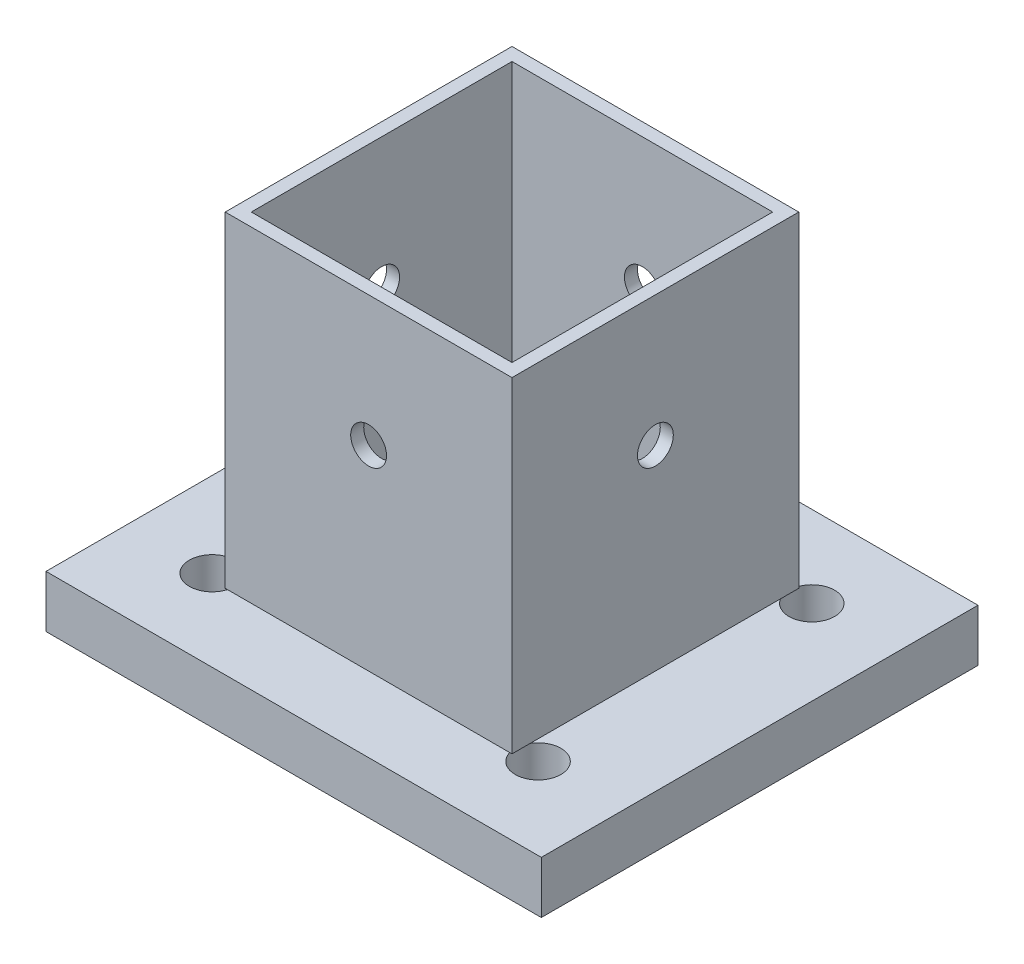
ISO-10303-21;
HEADER;
FILE_DESCRIPTION(('STEP AP214'),'2;1');
FILE_NAME('part.step','',(''),(''),'','','');
FILE_SCHEMA(('AUTOMOTIVE_DESIGN { 1 0 10303 214 1 1 1 1 }'));
ENDSEC;
DATA;
#1=APPLICATION_CONTEXT('core data for automotive mechanical design processes');
#2=APPLICATION_PROTOCOL_DEFINITION('international standard','automotive_design',2000,#1);
#3=PRODUCT_CONTEXT('',#1,'mechanical');
#4=PRODUCT('Part','Part','',(#3));
#5=PRODUCT_RELATED_PRODUCT_CATEGORY('part','',(#4));
#6=PRODUCT_DEFINITION_FORMATION('','',#4);
#7=PRODUCT_DEFINITION_CONTEXT('part definition',#1,'design');
#8=PRODUCT_DEFINITION('design','',#6,#7);
#9=PRODUCT_DEFINITION_SHAPE('','',#8);
#10=(LENGTH_UNIT() NAMED_UNIT(*) SI_UNIT(.MILLI.,.METRE.));
#11=(NAMED_UNIT(*) PLANE_ANGLE_UNIT() SI_UNIT($,.RADIAN.));
#12=(NAMED_UNIT(*) SI_UNIT($,.STERADIAN.) SOLID_ANGLE_UNIT());
#13=UNCERTAINTY_MEASURE_WITH_UNIT(LENGTH_MEASURE(1.E-05),#10,'distance_accuracy_value','');
#14=(GEOMETRIC_REPRESENTATION_CONTEXT(3) GLOBAL_UNCERTAINTY_ASSIGNED_CONTEXT((#13)) GLOBAL_UNIT_ASSIGNED_CONTEXT((#10,
#11,#12)) REPRESENTATION_CONTEXT('',''));
#15=CARTESIAN_POINT('',(0.,0.,0.));
#16=DIRECTION('',(0.,0.,1.));
#17=DIRECTION('',(1.,0.,0.));
#18=AXIS2_PLACEMENT_3D('',#15,#16,#17);
#19=CARTESIAN_POINT('',(0.,7.99999999999998,0.));
#20=DIRECTION('',(0.,-1.,0.));
#21=DIRECTION('',(0.,0.,-1.));
#22=AXIS2_PLACEMENT_3D('',#19,#20,#21);
#23=PLANE('',#22);
#24=DIRECTION('',(0.,0.,1.));
#25=VECTOR('',#24,1.);
#26=CARTESIAN_POINT('',(-38.,7.99999999999998,-33.4999999999999));
#27=LINE('',#26,#25);
#28=CARTESIAN_POINT('',(-38.,7.99999999999998,-33.4999999999999));
#29=VERTEX_POINT('',#28);
#30=CARTESIAN_POINT('',(-38.,7.99999999999998,33.5000000000001));
#31=VERTEX_POINT('',#30);
#32=EDGE_CURVE('E292',#29,#31,#27,.T.);
#33=ORIENTED_EDGE('',*,*,#32,.T.);
#34=DIRECTION('',(1.,0.,0.));
#35=VECTOR('',#34,1.);
#36=CARTESIAN_POINT('',(38.,8.00000000000001,33.4999999999999));
#37=LINE('',#36,#35);
#38=CARTESIAN_POINT('',(38.,8.00000000000001,33.4999999999999));
#39=VERTEX_POINT('',#38);
#40=EDGE_CURVE('E295',#31,#39,#37,.T.);
#41=ORIENTED_EDGE('',*,*,#40,.T.);
#42=DIRECTION('',(0.,0.,-1.));
#43=VECTOR('',#42,1.);
#44=CARTESIAN_POINT('',(38.,8.00000000000001,-33.5000000000001));
#45=LINE('',#44,#43);
#46=CARTESIAN_POINT('',(38.,8.00000000000001,-33.5000000000001));
#47=VERTEX_POINT('',#46);
#48=EDGE_CURVE('E298',#39,#47,#45,.T.);
#49=ORIENTED_EDGE('',*,*,#48,.T.);
#50=DIRECTION('',(-1.,0.,0.));
#51=VECTOR('',#50,1.);
#52=CARTESIAN_POINT('',(38.,8.00000000000001,-33.5000000000001));
#53=LINE('',#52,#51);
#54=EDGE_CURVE('E300',#47,#29,#53,.T.);
#55=ORIENTED_EDGE('',*,*,#54,.T.);
#56=EDGE_LOOP('',(#33,#41,#49,#55));
#57=FACE_BOUND('',#56,.T.);
#58=DIRECTION('',(0.,0.,1.));
#59=VECTOR('',#58,1.);
#60=CARTESIAN_POINT('',(-22.,8.00000000000001,0.));
#61=LINE('',#60,#59);
#62=CARTESIAN_POINT('',(-22.,8.00000000000001,-19.197224362268));
#63=VERTEX_POINT('',#62);
#64=CARTESIAN_POINT('',(-22.,8.00000000000001,19.197224362268));
#65=VERTEX_POINT('',#64);
#66=EDGE_CURVE('E14',#63,#65,#61,.T.);
#67=ORIENTED_EDGE('',*,*,#66,.F.);
#68=CARTESIAN_POINT('',(-25.,8.00000000000001,-20.9999999999999));
#69=DIRECTION('',(0.,1.,0.));
#70=DIRECTION('',(0.,0.,1.));
#71=AXIS2_PLACEMENT_3D('',#68,#69,#70);
#72=CIRCLE('',#71,3.5);
#73=CARTESIAN_POINT('',(-21.6458980337503,8.00000000000001,-22.));
#74=VERTEX_POINT('',#73);
#75=EDGE_CURVE('E289',#74,#63,#72,.T.);
#76=ORIENTED_EDGE('',*,*,#75,.F.);
#77=DIRECTION('',(-1.,0.,0.));
#78=VECTOR('',#77,1.);
#79=CARTESIAN_POINT('',(0.,7.99999999999998,-22.));
#80=LINE('',#79,#78);
#81=CARTESIAN_POINT('',(21.6458980337503,7.99999999999998,-22.));
#82=VERTEX_POINT('',#81);
#83=EDGE_CURVE('E80',#82,#74,#80,.T.);
#84=ORIENTED_EDGE('',*,*,#83,.F.);
#85=CARTESIAN_POINT('',(25.,7.99999999999998,-21.0000000000001));
#86=DIRECTION('',(0.,1.,0.));
#87=DIRECTION('',(0.,0.,-1.));
#88=AXIS2_PLACEMENT_3D('',#85,#86,#87);
#89=CIRCLE('',#88,3.5);
#90=CARTESIAN_POINT('',(22.,7.99999999999998,-19.197224362268));
#91=VERTEX_POINT('',#90);
#92=EDGE_CURVE('E282',#91,#82,#89,.T.);
#93=ORIENTED_EDGE('',*,*,#92,.F.);
#94=DIRECTION('',(0.,0.,-1.));
#95=VECTOR('',#94,1.);
#96=CARTESIAN_POINT('',(22.,7.99999999999998,0.));
#97=LINE('',#96,#95);
#98=CARTESIAN_POINT('',(22.,7.99999999999998,19.197224362268));
#99=VERTEX_POINT('',#98);
#100=EDGE_CURVE('E252',#99,#91,#97,.T.);
#101=ORIENTED_EDGE('',*,*,#100,.F.);
#102=CARTESIAN_POINT('',(25.,7.99999999999998,20.9999999999999));
#103=DIRECTION('',(0.,1.,0.));
#104=DIRECTION('',(0.,0.,1.));
#105=AXIS2_PLACEMENT_3D('',#102,#103,#104);
#106=CIRCLE('',#105,3.5);
#107=CARTESIAN_POINT('',(21.6458980337503,7.99999999999998,22.));
#108=VERTEX_POINT('',#107);
#109=EDGE_CURVE('E275',#108,#99,#106,.T.);
#110=ORIENTED_EDGE('',*,*,#109,.F.);
#111=DIRECTION('',(1.,0.,0.));
#112=VECTOR('',#111,1.);
#113=CARTESIAN_POINT('',(0.,7.99999999999998,22.));
#114=LINE('',#113,#112);
#115=CARTESIAN_POINT('',(-21.6458980337503,8.00000000000001,22.));
#116=VERTEX_POINT('',#115);
#117=EDGE_CURVE('E247',#116,#108,#114,.T.);
#118=ORIENTED_EDGE('',*,*,#117,.F.);
#119=CARTESIAN_POINT('',(-25.,8.00000000000001,21.0000000000001));
#120=DIRECTION('',(0.,1.,0.));
#121=DIRECTION('',(0.,0.,-1.));
#122=AXIS2_PLACEMENT_3D('',#119,#120,#121);
#123=CIRCLE('',#122,3.5);
#124=EDGE_CURVE('E98',#65,#116,#123,.T.);
#125=ORIENTED_EDGE('',*,*,#124,.F.);
#126=EDGE_LOOP('',(#67,#76,#84,#93,#101,#110,#118,#125));
#127=FACE_BOUND('',#126,.T.);
#128=ADVANCED_FACE('F71',(#57,#127),#23,.F.);
#129=CARTESIAN_POINT('',(0.,0.,0.));
#130=DIRECTION('',(0.,-1.,0.));
#131=DIRECTION('',(0.,0.,-1.));
#132=AXIS2_PLACEMENT_3D('',#129,#130,#131);
#133=PLANE('',#132);
#134=CARTESIAN_POINT('',(25.,0.,20.9999999999999));
#135=DIRECTION('',(0.,1.,0.));
#136=DIRECTION('',(0.,0.,1.));
#137=AXIS2_PLACEMENT_3D('',#134,#135,#136);
#138=CIRCLE('',#137,3.5);
#139=CARTESIAN_POINT('',(25.,0.,24.4999999999999));
#140=VERTEX_POINT('',#139);
#141=EDGE_CURVE('E269',#140,#140,#138,.T.);
#142=ORIENTED_EDGE('',*,*,#141,.T.);
#143=EDGE_LOOP('',(#142));
#144=FACE_BOUND('',#143,.T.);
#145=CARTESIAN_POINT('',(-25.,0.,-20.9999999999999));
#146=DIRECTION('',(0.,1.,0.));
#147=DIRECTION('',(0.,0.,1.));
#148=AXIS2_PLACEMENT_3D('',#145,#146,#147);
#149=CIRCLE('',#148,3.5);
#150=CARTESIAN_POINT('',(-25.,0.,-17.4999999999999));
#151=VERTEX_POINT('',#150);
#152=EDGE_CURVE('E281',#151,#151,#149,.T.);
#153=ORIENTED_EDGE('',*,*,#152,.T.);
#154=EDGE_LOOP('',(#153));
#155=FACE_BOUND('',#154,.T.);
#156=DIRECTION('',(0.,0.,1.));
#157=VECTOR('',#156,1.);
#158=CARTESIAN_POINT('',(-38.,0.,-33.4999999999999));
#159=LINE('',#158,#157);
#160=CARTESIAN_POINT('',(-38.,0.,-33.4999999999999));
#161=VERTEX_POINT('',#160);
#162=CARTESIAN_POINT('',(-38.,0.,33.5000000000001));
#163=VERTEX_POINT('',#162);
#164=EDGE_CURVE('E288',#161,#163,#159,.T.);
#165=ORIENTED_EDGE('',*,*,#164,.F.);
#166=DIRECTION('',(-1.,0.,0.));
#167=VECTOR('',#166,1.);
#168=CARTESIAN_POINT('',(37.9999999999998,0.,-33.5000000000001));
#169=LINE('',#168,#167);
#170=CARTESIAN_POINT('',(37.9999999999998,0.,-33.5000000000001));
#171=VERTEX_POINT('',#170);
#172=EDGE_CURVE('E296',#171,#161,#169,.T.);
#173=ORIENTED_EDGE('',*,*,#172,.F.);
#174=DIRECTION('',(0.,0.,-1.));
#175=VECTOR('',#174,1.);
#176=CARTESIAN_POINT('',(37.9999999999998,0.,-33.5000000000001));
#177=LINE('',#176,#175);
#178=CARTESIAN_POINT('',(38.,0.,33.4999999999999));
#179=VERTEX_POINT('',#178);
#180=EDGE_CURVE('E307',#179,#171,#177,.T.);
#181=ORIENTED_EDGE('',*,*,#180,.F.);
#182=DIRECTION('',(1.,0.,0.));
#183=VECTOR('',#182,1.);
#184=CARTESIAN_POINT('',(38.,0.,33.4999999999999));
#185=LINE('',#184,#183);
#186=EDGE_CURVE('E305',#163,#179,#185,.T.);
#187=ORIENTED_EDGE('',*,*,#186,.F.);
#188=EDGE_LOOP('',(#165,#173,#181,#187));
#189=FACE_BOUND('',#188,.T.);
#190=CARTESIAN_POINT('',(24.9999999999998,0.,-21.0000000000001));
#191=DIRECTION('',(0.,1.,0.));
#192=DIRECTION('',(0.,0.,-1.));
#193=AXIS2_PLACEMENT_3D('',#190,#191,#192);
#194=CIRCLE('',#193,3.5);
#195=CARTESIAN_POINT('',(24.9999999999998,0.,-24.5000000000001));
#196=VERTEX_POINT('',#195);
#197=EDGE_CURVE('E274',#196,#196,#194,.T.);
#198=ORIENTED_EDGE('',*,*,#197,.T.);
#199=EDGE_LOOP('',(#198));
#200=FACE_BOUND('',#199,.T.);
#201=CARTESIAN_POINT('',(-25.,0.,21.0000000000001));
#202=DIRECTION('',(0.,1.,0.));
#203=DIRECTION('',(0.,0.,-1.));
#204=AXIS2_PLACEMENT_3D('',#201,#202,#203);
#205=CIRCLE('',#204,3.5);
#206=CARTESIAN_POINT('',(-25.,0.,17.5000000000001));
#207=VERTEX_POINT('',#206);
#208=EDGE_CURVE('E266',#207,#207,#205,.T.);
#209=ORIENTED_EDGE('',*,*,#208,.T.);
#210=EDGE_LOOP('',(#209));
#211=FACE_BOUND('',#210,.T.);
#212=ADVANCED_FACE('F361',(#144,#155,#189,#200,#211),#133,.T.);
#213=CARTESIAN_POINT('',(-38.,7.99999999999998,-33.4999999999999));
#214=DIRECTION('',(1.,0.,0.));
#215=DIRECTION('',(0.,0.,-1.));
#216=AXIS2_PLACEMENT_3D('',#213,#214,#215);
#217=PLANE('',#216);
#218=ORIENTED_EDGE('',*,*,#164,.T.);
#219=DIRECTION('',(0.,-1.,0.));
#220=VECTOR('',#219,1.);
#221=CARTESIAN_POINT('',(-38.,7.99999999999998,33.5000000000001));
#222=LINE('',#221,#220);
#223=EDGE_CURVE('E75',#31,#163,#222,.T.);
#224=ORIENTED_EDGE('',*,*,#223,.F.);
#225=ORIENTED_EDGE('',*,*,#32,.F.);
#226=DIRECTION('',(0.,-1.,0.));
#227=VECTOR('',#226,1.);
#228=CARTESIAN_POINT('',(-38.,7.99999999999998,-33.4999999999999));
#229=LINE('',#228,#227);
#230=EDGE_CURVE('E302',#29,#161,#229,.T.);
#231=ORIENTED_EDGE('',*,*,#230,.T.);
#232=EDGE_LOOP('',(#218,#224,#225,#231));
#233=FACE_BOUND('',#232,.T.);
#234=ADVANCED_FACE('F73',(#233),#217,.F.);
#235=CARTESIAN_POINT('',(38.,8.00000000000001,33.4999999999999));
#236=DIRECTION('',(0.,0.,-1.));
#237=DIRECTION('',(-1.,0.,0.));
#238=AXIS2_PLACEMENT_3D('',#235,#236,#237);
#239=PLANE('',#238);
#240=ORIENTED_EDGE('',*,*,#186,.T.);
#241=DIRECTION('',(0.,-1.,0.));
#242=VECTOR('',#241,1.);
#243=CARTESIAN_POINT('',(38.,8.00000000000001,33.4999999999999));
#244=LINE('',#243,#242);
#245=EDGE_CURVE('E314',#39,#179,#244,.T.);
#246=ORIENTED_EDGE('',*,*,#245,.F.);
#247=ORIENTED_EDGE('',*,*,#40,.F.);
#248=ORIENTED_EDGE('',*,*,#223,.T.);
#249=EDGE_LOOP('',(#240,#246,#247,#248));
#250=FACE_BOUND('',#249,.T.);
#251=ADVANCED_FACE('F465',(#250),#239,.F.);
#252=CARTESIAN_POINT('',(38.,8.00000000000001,-33.5000000000001));
#253=DIRECTION('',(-1.,0.,0.));
#254=DIRECTION('',(0.,0.,1.));
#255=AXIS2_PLACEMENT_3D('',#252,#253,#254);
#256=PLANE('',#255);
#257=ORIENTED_EDGE('',*,*,#180,.T.);
#258=DIRECTION('',(0.,-1.,0.));
#259=VECTOR('',#258,1.);
#260=CARTESIAN_POINT('',(38.,8.00000000000001,-33.5000000000001));
#261=LINE('',#260,#259);
#262=EDGE_CURVE('E312',#47,#171,#261,.T.);
#263=ORIENTED_EDGE('',*,*,#262,.F.);
#264=ORIENTED_EDGE('',*,*,#48,.F.);
#265=ORIENTED_EDGE('',*,*,#245,.T.);
#266=EDGE_LOOP('',(#257,#263,#264,#265));
#267=FACE_BOUND('',#266,.T.);
#268=ADVANCED_FACE('F464',(#267),#256,.F.);
#269=CARTESIAN_POINT('',(38.,8.00000000000001,-33.5000000000001));
#270=DIRECTION('',(0.,0.,1.));
#271=DIRECTION('',(1.,0.,0.));
#272=AXIS2_PLACEMENT_3D('',#269,#270,#271);
#273=PLANE('',#272);
#274=ORIENTED_EDGE('',*,*,#172,.T.);
#275=ORIENTED_EDGE('',*,*,#230,.F.);
#276=ORIENTED_EDGE('',*,*,#54,.F.);
#277=ORIENTED_EDGE('',*,*,#262,.T.);
#278=EDGE_LOOP('',(#274,#275,#276,#277));
#279=FACE_BOUND('',#278,.T.);
#280=ADVANCED_FACE('F452',(#279),#273,.F.);
#281=CARTESIAN_POINT('',(-25.,8.00000000000001,-20.9999999999999));
#282=DIRECTION('',(0.,-1.,0.));
#283=DIRECTION('',(0.,0.,-1.));
#284=AXIS2_PLACEMENT_3D('',#281,#282,#283);
#285=CYLINDRICAL_SURFACE('',#284,3.5);
#286=EDGE_CURVE('E285',#63,#74,#72,.T.);
#287=ORIENTED_EDGE('',*,*,#286,.T.);
#288=ORIENTED_EDGE('',*,*,#75,.T.);
#289=EDGE_LOOP('',(#287,#288));
#290=FACE_BOUND('',#289,.T.);
#291=ORIENTED_EDGE('',*,*,#152,.F.);
#292=EDGE_LOOP('',(#291));
#293=FACE_BOUND('',#292,.T.);
#294=ADVANCED_FACE('F357',(#290,#293),#285,.F.);
#295=CARTESIAN_POINT('',(25.,7.99999999999998,-21.0000000000001));
#296=DIRECTION('',(0.,-1.,0.));
#297=DIRECTION('',(0.,0.,-1.));
#298=AXIS2_PLACEMENT_3D('',#295,#296,#297);
#299=CYLINDRICAL_SURFACE('',#298,3.5);
#300=EDGE_CURVE('E278',#82,#91,#89,.T.);
#301=ORIENTED_EDGE('',*,*,#300,.T.);
#302=ORIENTED_EDGE('',*,*,#92,.T.);
#303=EDGE_LOOP('',(#301,#302));
#304=FACE_BOUND('',#303,.T.);
#305=ORIENTED_EDGE('',*,*,#197,.F.);
#306=EDGE_LOOP('',(#305));
#307=FACE_BOUND('',#306,.T.);
#308=ADVANCED_FACE('F354',(#304,#307),#299,.F.);
#309=CARTESIAN_POINT('',(25.,7.99999999999998,20.9999999999999));
#310=DIRECTION('',(0.,-1.,0.));
#311=DIRECTION('',(0.,0.,-1.));
#312=AXIS2_PLACEMENT_3D('',#309,#310,#311);
#313=CYLINDRICAL_SURFACE('',#312,3.5);
#314=EDGE_CURVE('E272',#99,#108,#106,.T.);
#315=ORIENTED_EDGE('',*,*,#314,.T.);
#316=ORIENTED_EDGE('',*,*,#109,.T.);
#317=EDGE_LOOP('',(#315,#316));
#318=FACE_BOUND('',#317,.T.);
#319=ORIENTED_EDGE('',*,*,#141,.F.);
#320=EDGE_LOOP('',(#319));
#321=FACE_BOUND('',#320,.T.);
#322=ADVANCED_FACE('F340',(#318,#321),#313,.F.);
#323=CARTESIAN_POINT('',(-25.,8.00000000000001,21.0000000000001));
#324=DIRECTION('',(0.,-1.,0.));
#325=DIRECTION('',(0.,0.,-1.));
#326=AXIS2_PLACEMENT_3D('',#323,#324,#325);
#327=CYLINDRICAL_SURFACE('',#326,3.5);
#328=EDGE_CURVE('E267',#116,#65,#123,.T.);
#329=ORIENTED_EDGE('',*,*,#328,.T.);
#330=ORIENTED_EDGE('',*,*,#124,.T.);
#331=EDGE_LOOP('',(#329,#330));
#332=FACE_BOUND('',#331,.T.);
#333=ORIENTED_EDGE('',*,*,#208,.F.);
#334=EDGE_LOOP('',(#333));
#335=FACE_BOUND('',#334,.T.);
#336=ADVANCED_FACE('F368',(#332,#335),#327,.F.);
#337=CARTESIAN_POINT('',(0.,7.99999999999998,0.));
#338=DIRECTION('',(0.,1.,0.));
#339=DIRECTION('',(0.,0.,1.));
#340=AXIS2_PLACEMENT_3D('',#337,#338,#339);
#341=PLANE('',#340);
#342=ORIENTED_EDGE('',*,*,#286,.F.);
#343=CARTESIAN_POINT('',(-22.,8.00000000000001,-22.));
#344=VERTEX_POINT('',#343);
#345=EDGE_CURVE('E82',#344,#63,#61,.T.);
#346=ORIENTED_EDGE('',*,*,#345,.F.);
#347=EDGE_CURVE('E251',#74,#344,#80,.T.);
#348=ORIENTED_EDGE('',*,*,#347,.F.);
#349=EDGE_LOOP('',(#342,#346,#348));
#350=FACE_BOUND('',#349,.T.);
#351=ADVANCED_FACE('F370',(#350),#341,.F.);
#352=ORIENTED_EDGE('',*,*,#300,.F.);
#353=CARTESIAN_POINT('',(22.,7.99999999999998,-22.));
#354=VERTEX_POINT('',#353);
#355=EDGE_CURVE('E234',#354,#82,#80,.T.);
#356=ORIENTED_EDGE('',*,*,#355,.F.);
#357=EDGE_CURVE('E246',#91,#354,#97,.T.);
#358=ORIENTED_EDGE('',*,*,#357,.F.);
#359=EDGE_LOOP('',(#352,#356,#358));
#360=FACE_BOUND('',#359,.T.);
#361=ADVANCED_FACE('F352',(#360),#341,.F.);
#362=ORIENTED_EDGE('',*,*,#314,.F.);
#363=CARTESIAN_POINT('',(22.,7.99999999999998,22.));
#364=VERTEX_POINT('',#363);
#365=EDGE_CURVE('E248',#364,#99,#97,.T.);
#366=ORIENTED_EDGE('',*,*,#365,.F.);
#367=EDGE_CURVE('E242',#108,#364,#114,.T.);
#368=ORIENTED_EDGE('',*,*,#367,.F.);
#369=EDGE_LOOP('',(#362,#366,#368));
#370=FACE_BOUND('',#369,.T.);
#371=ADVANCED_FACE('F336',(#370),#341,.F.);
#372=CARTESIAN_POINT('',(0.,58.,0.));
#373=DIRECTION('',(0.,1.,0.));
#374=DIRECTION('',(0.,0.,1.));
#375=AXIS2_PLACEMENT_3D('',#372,#373,#374);
#376=PLANE('',#375);
#377=DIRECTION('',(0.,0.,1.));
#378=VECTOR('',#377,1.);
#379=CARTESIAN_POINT('',(-22.,58.,0.));
#380=LINE('',#379,#378);
#381=CARTESIAN_POINT('',(-22.,58.,-22.));
#382=VERTEX_POINT('',#381);
#383=CARTESIAN_POINT('',(-22.,58.,22.));
#384=VERTEX_POINT('',#383);
#385=EDGE_CURVE('E230',#382,#384,#380,.T.);
#386=ORIENTED_EDGE('',*,*,#385,.T.);
#387=DIRECTION('',(1.,0.,0.));
#388=VECTOR('',#387,1.);
#389=CARTESIAN_POINT('',(0.,58.,22.));
#390=LINE('',#389,#388);
#391=CARTESIAN_POINT('',(22.,58.,22.));
#392=VERTEX_POINT('',#391);
#393=EDGE_CURVE('E233',#384,#392,#390,.T.);
#394=ORIENTED_EDGE('',*,*,#393,.T.);
#395=DIRECTION('',(0.,0.,-1.));
#396=VECTOR('',#395,1.);
#397=CARTESIAN_POINT('',(21.9999999999998,58.,0.));
#398=LINE('',#397,#396);
#399=CARTESIAN_POINT('',(22.,58.,-22.));
#400=VERTEX_POINT('',#399);
#401=EDGE_CURVE('E236',#392,#400,#398,.T.);
#402=ORIENTED_EDGE('',*,*,#401,.T.);
#403=DIRECTION('',(-1.,0.,0.));
#404=VECTOR('',#403,1.);
#405=CARTESIAN_POINT('',(0.,58.,-22.));
#406=LINE('',#405,#404);
#407=EDGE_CURVE('E238',#400,#382,#406,.T.);
#408=ORIENTED_EDGE('',*,*,#407,.T.);
#409=EDGE_LOOP('',(#386,#394,#402,#408));
#410=FACE_BOUND('',#409,.T.);
#411=DIRECTION('',(1.,0.,0.));
#412=VECTOR('',#411,1.);
#413=CARTESIAN_POINT('',(20.,58.,20.));
#414=LINE('',#413,#412);
#415=CARTESIAN_POINT('',(-20.,57.9999999999999,20.));
#416=VERTEX_POINT('',#415);
#417=CARTESIAN_POINT('',(20.,58.,20.));
#418=VERTEX_POINT('',#417);
#419=EDGE_CURVE('E197',#416,#418,#414,.T.);
#420=ORIENTED_EDGE('',*,*,#419,.F.);
#421=DIRECTION('',(0.,0.,1.));
#422=VECTOR('',#421,1.);
#423=CARTESIAN_POINT('',(-20.,57.9999999999999,-20.));
#424=LINE('',#423,#422);
#425=CARTESIAN_POINT('',(-20.,57.9999999999999,-20.));
#426=VERTEX_POINT('',#425);
#427=EDGE_CURVE('E189',#426,#416,#424,.T.);
#428=ORIENTED_EDGE('',*,*,#427,.F.);
#429=DIRECTION('',(-1.,0.,0.));
#430=VECTOR('',#429,1.);
#431=CARTESIAN_POINT('',(20.,58.,-20.));
#432=LINE('',#431,#430);
#433=CARTESIAN_POINT('',(20.,58.,-20.));
#434=VERTEX_POINT('',#433);
#435=EDGE_CURVE('E212',#434,#426,#432,.T.);
#436=ORIENTED_EDGE('',*,*,#435,.F.);
#437=DIRECTION('',(0.,0.,-1.));
#438=VECTOR('',#437,1.);
#439=CARTESIAN_POINT('',(20.,58.,-20.));
#440=LINE('',#439,#438);
#441=EDGE_CURVE('E210',#418,#434,#440,.T.);
#442=ORIENTED_EDGE('',*,*,#441,.F.);
#443=EDGE_LOOP('',(#420,#428,#436,#442));
#444=FACE_BOUND('',#443,.T.);
#445=ADVANCED_FACE('F208',(#410,#444),#376,.T.);
#446=ORIENTED_EDGE('',*,*,#328,.F.);
#447=CARTESIAN_POINT('',(-22.,8.00000000000001,22.));
#448=VERTEX_POINT('',#447);
#449=EDGE_CURVE('E243',#448,#116,#114,.T.);
#450=ORIENTED_EDGE('',*,*,#449,.F.);
#451=EDGE_CURVE('E83',#65,#448,#61,.T.);
#452=ORIENTED_EDGE('',*,*,#451,.F.);
#453=EDGE_LOOP('',(#446,#450,#452));
#454=FACE_BOUND('',#453,.T.);
#455=ADVANCED_FACE('F379',(#454),#341,.F.);
#456=CARTESIAN_POINT('',(-22.,58.,0.));
#457=DIRECTION('',(1.,0.,0.));
#458=DIRECTION('',(0.,0.,-1.));
#459=AXIS2_PLACEMENT_3D('',#456,#457,#458);
#460=PLANE('',#459);
#461=CARTESIAN_POINT('',(-22.,38.,0.));
#462=DIRECTION('',(-1.,0.,0.));
#463=DIRECTION('',(0.,0.,1.));
#464=AXIS2_PLACEMENT_3D('',#461,#462,#463);
#465=CIRCLE('',#464,2.75);
#466=CARTESIAN_POINT('',(-22.,38.,2.75));
#467=VERTEX_POINT('',#466);
#468=EDGE_CURVE('E439',#467,#467,#465,.T.);
#469=ORIENTED_EDGE('',*,*,#468,.F.);
#470=EDGE_LOOP('',(#469));
#471=FACE_BOUND('',#470,.T.);
#472=ORIENTED_EDGE('',*,*,#345,.T.);
#473=ORIENTED_EDGE('',*,*,#66,.T.);
#474=ORIENTED_EDGE('',*,*,#451,.T.);
#475=DIRECTION('',(0.,-1.,0.));
#476=VECTOR('',#475,1.);
#477=CARTESIAN_POINT('',(-22.,58.,22.));
#478=LINE('',#477,#476);
#479=EDGE_CURVE('E263',#384,#448,#478,.T.);
#480=ORIENTED_EDGE('',*,*,#479,.F.);
#481=ORIENTED_EDGE('',*,*,#385,.F.);
#482=DIRECTION('',(0.,-1.,0.));
#483=VECTOR('',#482,1.);
#484=CARTESIAN_POINT('',(-22.,58.,-22.));
#485=LINE('',#484,#483);
#486=EDGE_CURVE('E239',#382,#344,#485,.T.);
#487=ORIENTED_EDGE('',*,*,#486,.T.);
#488=EDGE_LOOP('',(#472,#473,#474,#480,#481,#487));
#489=FACE_BOUND('',#488,.T.);
#490=ADVANCED_FACE('F422',(#471,#489),#460,.F.);
#491=CARTESIAN_POINT('',(0.,58.,22.));
#492=DIRECTION('',(0.,0.,-1.));
#493=DIRECTION('',(-1.,0.,0.));
#494=AXIS2_PLACEMENT_3D('',#491,#492,#493);
#495=PLANE('',#494);
#496=CARTESIAN_POINT('',(0.,38.,22.));
#497=DIRECTION('',(0.,0.,1.));
#498=DIRECTION('',(1.,0.,0.));
#499=AXIS2_PLACEMENT_3D('',#496,#497,#498);
#500=CIRCLE('',#499,2.75);
#501=CARTESIAN_POINT('',(2.75,38.,22.));
#502=VERTEX_POINT('',#501);
#503=EDGE_CURVE('E219',#502,#502,#500,.T.);
#504=ORIENTED_EDGE('',*,*,#503,.F.);
#505=EDGE_LOOP('',(#504));
#506=FACE_BOUND('',#505,.T.);
#507=ORIENTED_EDGE('',*,*,#449,.T.);
#508=ORIENTED_EDGE('',*,*,#117,.T.);
#509=ORIENTED_EDGE('',*,*,#367,.T.);
#510=DIRECTION('',(0.,-1.,0.));
#511=VECTOR('',#510,1.);
#512=CARTESIAN_POINT('',(22.,58.,22.));
#513=LINE('',#512,#511);
#514=EDGE_CURVE('E260',#392,#364,#513,.T.);
#515=ORIENTED_EDGE('',*,*,#514,.F.);
#516=ORIENTED_EDGE('',*,*,#393,.F.);
#517=ORIENTED_EDGE('',*,*,#479,.T.);
#518=EDGE_LOOP('',(#507,#508,#509,#515,#516,#517));
#519=FACE_BOUND('',#518,.T.);
#520=ADVANCED_FACE('F328',(#506,#519),#495,.F.);
#521=CARTESIAN_POINT('',(21.9999999999998,58.,0.));
#522=DIRECTION('',(-1.,0.,0.));
#523=DIRECTION('',(0.,0.,1.));
#524=AXIS2_PLACEMENT_3D('',#521,#522,#523);
#525=PLANE('',#524);
#526=CARTESIAN_POINT('',(22.,38.,2.22044604925031E-13));
#527=DIRECTION('',(1.,0.,0.));
#528=DIRECTION('',(0.,0.,-1.));
#529=AXIS2_PLACEMENT_3D('',#526,#527,#528);
#530=CIRCLE('',#529,2.75);
#531=CARTESIAN_POINT('',(22.,38.,-2.74999999999978));
#532=VERTEX_POINT('',#531);
#533=EDGE_CURVE('E587',#532,#532,#530,.T.);
#534=ORIENTED_EDGE('',*,*,#533,.F.);
#535=EDGE_LOOP('',(#534));
#536=FACE_BOUND('',#535,.T.);
#537=ORIENTED_EDGE('',*,*,#365,.T.);
#538=ORIENTED_EDGE('',*,*,#100,.T.);
#539=ORIENTED_EDGE('',*,*,#357,.T.);
#540=DIRECTION('',(0.,-1.,0.));
#541=VECTOR('',#540,1.);
#542=CARTESIAN_POINT('',(22.,58.,-22.));
#543=LINE('',#542,#541);
#544=EDGE_CURVE('E257',#400,#354,#543,.T.);
#545=ORIENTED_EDGE('',*,*,#544,.F.);
#546=ORIENTED_EDGE('',*,*,#401,.F.);
#547=ORIENTED_EDGE('',*,*,#514,.T.);
#548=EDGE_LOOP('',(#537,#538,#539,#545,#546,#547));
#549=FACE_BOUND('',#548,.T.);
#550=ADVANCED_FACE('F334',(#536,#549),#525,.F.);
#551=CARTESIAN_POINT('',(0.,58.,-22.));
#552=DIRECTION('',(0.,0.,1.));
#553=DIRECTION('',(1.,0.,0.));
#554=AXIS2_PLACEMENT_3D('',#551,#552,#553);
#555=PLANE('',#554);
#556=CARTESIAN_POINT('',(0.,38.,-22.));
#557=DIRECTION('',(0.,0.,-1.));
#558=DIRECTION('',(-1.,0.,0.));
#559=AXIS2_PLACEMENT_3D('',#556,#557,#558);
#560=CIRCLE('',#559,2.75);
#561=CARTESIAN_POINT('',(-2.75,38.,-22.));
#562=VERTEX_POINT('',#561);
#563=EDGE_CURVE('E581',#562,#562,#560,.T.);
#564=ORIENTED_EDGE('',*,*,#563,.F.);
#565=EDGE_LOOP('',(#564));
#566=FACE_BOUND('',#565,.T.);
#567=ORIENTED_EDGE('',*,*,#355,.T.);
#568=ORIENTED_EDGE('',*,*,#83,.T.);
#569=ORIENTED_EDGE('',*,*,#347,.T.);
#570=ORIENTED_EDGE('',*,*,#486,.F.);
#571=ORIENTED_EDGE('',*,*,#407,.F.);
#572=ORIENTED_EDGE('',*,*,#544,.T.);
#573=EDGE_LOOP('',(#567,#568,#569,#570,#571,#572));
#574=FACE_BOUND('',#573,.T.);
#575=ADVANCED_FACE('F349',(#566,#574),#555,.F.);
#576=CARTESIAN_POINT('',(-20.,57.9999999999999,-20.));
#577=DIRECTION('',(1.,0.,0.));
#578=DIRECTION('',(0.,0.,-1.));
#579=AXIS2_PLACEMENT_3D('',#576,#577,#578);
#580=PLANE('',#579);
#581=CARTESIAN_POINT('',(-20.,38.,0.));
#582=DIRECTION('',(1.,0.,0.));
#583=DIRECTION('',(0.,0.,-1.));
#584=AXIS2_PLACEMENT_3D('',#581,#582,#583);
#585=CIRCLE('',#584,2.75);
#586=CARTESIAN_POINT('',(-20.,38.,-2.75));
#587=VERTEX_POINT('',#586);
#588=EDGE_CURVE('E576',#587,#587,#585,.F.);
#589=ORIENTED_EDGE('',*,*,#588,.T.);
#590=EDGE_LOOP('',(#589));
#591=FACE_BOUND('',#590,.T.);
#592=DIRECTION('',(0.,0.,1.));
#593=VECTOR('',#592,1.);
#594=CARTESIAN_POINT('',(-20.,7.99999999999992,-20.));
#595=LINE('',#594,#593);
#596=CARTESIAN_POINT('',(-20.,7.99999999999992,-20.));
#597=VERTEX_POINT('',#596);
#598=CARTESIAN_POINT('',(-20.,7.99999999999992,20.));
#599=VERTEX_POINT('',#598);
#600=EDGE_CURVE('E217',#597,#599,#595,.T.);
#601=ORIENTED_EDGE('',*,*,#600,.F.);
#602=DIRECTION('',(0.,-1.,0.));
#603=VECTOR('',#602,1.);
#604=CARTESIAN_POINT('',(-20.,57.9999999999999,-20.));
#605=LINE('',#604,#603);
#606=EDGE_CURVE('E90',#426,#597,#605,.T.);
#607=ORIENTED_EDGE('',*,*,#606,.F.);
#608=ORIENTED_EDGE('',*,*,#427,.T.);
#609=DIRECTION('',(0.,-1.,0.));
#610=VECTOR('',#609,1.);
#611=CARTESIAN_POINT('',(-20.,57.9999999999999,20.));
#612=LINE('',#611,#610);
#613=EDGE_CURVE('E192',#416,#599,#612,.T.);
#614=ORIENTED_EDGE('',*,*,#613,.T.);
#615=EDGE_LOOP('',(#601,#607,#608,#614));
#616=FACE_BOUND('',#615,.T.);
#617=ADVANCED_FACE('F191',(#591,#616),#580,.T.);
#618=CARTESIAN_POINT('',(20.,58.,20.));
#619=DIRECTION('',(0.,0.,-1.));
#620=DIRECTION('',(-1.,0.,0.));
#621=AXIS2_PLACEMENT_3D('',#618,#619,#620);
#622=PLANE('',#621);
#623=CARTESIAN_POINT('',(0.,38.,20.));
#624=DIRECTION('',(0.,0.,-1.));
#625=DIRECTION('',(-1.,0.,0.));
#626=AXIS2_PLACEMENT_3D('',#623,#624,#625);
#627=CIRCLE('',#626,2.75);
#628=CARTESIAN_POINT('',(-2.75,38.,20.));
#629=VERTEX_POINT('',#628);
#630=EDGE_CURVE('E577',#629,#629,#627,.F.);
#631=ORIENTED_EDGE('',*,*,#630,.T.);
#632=EDGE_LOOP('',(#631));
#633=FACE_BOUND('',#632,.T.);
#634=DIRECTION('',(1.,0.,0.));
#635=VECTOR('',#634,1.);
#636=CARTESIAN_POINT('',(20.,8.00000000000001,20.));
#637=LINE('',#636,#635);
#638=CARTESIAN_POINT('',(20.,8.00000000000001,20.));
#639=VERTEX_POINT('',#638);
#640=EDGE_CURVE('E204',#599,#639,#637,.T.);
#641=ORIENTED_EDGE('',*,*,#640,.F.);
#642=ORIENTED_EDGE('',*,*,#613,.F.);
#643=ORIENTED_EDGE('',*,*,#419,.T.);
#644=DIRECTION('',(0.,-1.,0.));
#645=VECTOR('',#644,1.);
#646=CARTESIAN_POINT('',(20.,58.,20.));
#647=LINE('',#646,#645);
#648=EDGE_CURVE('E205',#418,#639,#647,.T.);
#649=ORIENTED_EDGE('',*,*,#648,.T.);
#650=EDGE_LOOP('',(#641,#642,#643,#649));
#651=FACE_BOUND('',#650,.T.);
#652=ADVANCED_FACE('F201',(#633,#651),#622,.T.);
#653=CARTESIAN_POINT('',(20.,58.,-20.));
#654=DIRECTION('',(-1.,0.,0.));
#655=DIRECTION('',(0.,0.,1.));
#656=AXIS2_PLACEMENT_3D('',#653,#654,#655);
#657=PLANE('',#656);
#658=CARTESIAN_POINT('',(20.,38.,2.22044604925031E-13));
#659=DIRECTION('',(-1.,0.,0.));
#660=DIRECTION('',(0.,0.,1.));
#661=AXIS2_PLACEMENT_3D('',#658,#659,#660);
#662=CIRCLE('',#661,2.75);
#663=CARTESIAN_POINT('',(20.,38.,2.75000000000022));
#664=VERTEX_POINT('',#663);
#665=EDGE_CURVE('E590',#664,#664,#662,.F.);
#666=ORIENTED_EDGE('',*,*,#665,.T.);
#667=EDGE_LOOP('',(#666));
#668=FACE_BOUND('',#667,.T.);
#669=DIRECTION('',(0.,0.,-1.));
#670=VECTOR('',#669,1.);
#671=CARTESIAN_POINT('',(20.,8.00000000000001,-20.));
#672=LINE('',#671,#670);
#673=CARTESIAN_POINT('',(20.,8.00000000000001,-20.));
#674=VERTEX_POINT('',#673);
#675=EDGE_CURVE('E221',#639,#674,#672,.T.);
#676=ORIENTED_EDGE('',*,*,#675,.F.);
#677=ORIENTED_EDGE('',*,*,#648,.F.);
#678=ORIENTED_EDGE('',*,*,#441,.T.);
#679=DIRECTION('',(0.,-1.,0.));
#680=VECTOR('',#679,1.);
#681=CARTESIAN_POINT('',(20.,58.,-20.));
#682=LINE('',#681,#680);
#683=EDGE_CURVE('E227',#434,#674,#682,.T.);
#684=ORIENTED_EDGE('',*,*,#683,.T.);
#685=EDGE_LOOP('',(#676,#677,#678,#684));
#686=FACE_BOUND('',#685,.T.);
#687=ADVANCED_FACE('F400',(#668,#686),#657,.T.);
#688=CARTESIAN_POINT('',(20.,58.,-20.));
#689=DIRECTION('',(0.,0.,1.));
#690=DIRECTION('',(1.,0.,0.));
#691=AXIS2_PLACEMENT_3D('',#688,#689,#690);
#692=PLANE('',#691);
#693=CARTESIAN_POINT('',(0.,38.,-20.));
#694=DIRECTION('',(0.,0.,1.));
#695=DIRECTION('',(1.,0.,0.));
#696=AXIS2_PLACEMENT_3D('',#693,#694,#695);
#697=CIRCLE('',#696,2.75);
#698=CARTESIAN_POINT('',(2.75,38.,-20.));
#699=VERTEX_POINT('',#698);
#700=EDGE_CURVE('E584',#699,#699,#697,.F.);
#701=ORIENTED_EDGE('',*,*,#700,.T.);
#702=EDGE_LOOP('',(#701));
#703=FACE_BOUND('',#702,.T.);
#704=DIRECTION('',(-1.,0.,0.));
#705=VECTOR('',#704,1.);
#706=CARTESIAN_POINT('',(20.,8.00000000000001,-20.));
#707=LINE('',#706,#705);
#708=EDGE_CURVE('E198',#674,#597,#707,.T.);
#709=ORIENTED_EDGE('',*,*,#708,.F.);
#710=ORIENTED_EDGE('',*,*,#683,.F.);
#711=ORIENTED_EDGE('',*,*,#435,.T.);
#712=ORIENTED_EDGE('',*,*,#606,.T.);
#713=EDGE_LOOP('',(#709,#710,#711,#712));
#714=FACE_BOUND('',#713,.T.);
#715=ADVANCED_FACE('F391',(#703,#714),#692,.T.);
#716=ORIENTED_EDGE('',*,*,#708,.T.);
#717=ORIENTED_EDGE('',*,*,#600,.T.);
#718=ORIENTED_EDGE('',*,*,#640,.T.);
#719=ORIENTED_EDGE('',*,*,#675,.T.);
#720=EDGE_LOOP('',(#716,#717,#718,#719));
#721=FACE_BOUND('',#720,.T.);
#722=ADVANCED_FACE('F385',(#721),#23,.F.);
#723=CARTESIAN_POINT('',(0.,38.,-33.501));
#724=DIRECTION('',(0.,0.,1.));
#725=DIRECTION('',(1.,0.,0.));
#726=AXIS2_PLACEMENT_3D('',#723,#724,#725);
#727=CYLINDRICAL_SURFACE('',#726,2.75);
#728=ORIENTED_EDGE('',*,*,#630,.F.);
#729=EDGE_LOOP('',(#728));
#730=FACE_BOUND('',#729,.T.);
#731=ORIENTED_EDGE('',*,*,#503,.T.);
#732=EDGE_LOOP('',(#731));
#733=FACE_BOUND('',#732,.T.);
#734=ADVANCED_FACE('F390',(#730,#733),#727,.F.);
#735=CARTESIAN_POINT('',(0.,38.,33.501));
#736=DIRECTION('',(0.,0.,-1.));
#737=DIRECTION('',(-1.,0.,0.));
#738=AXIS2_PLACEMENT_3D('',#735,#736,#737);
#739=CYLINDRICAL_SURFACE('',#738,2.75);
#740=ORIENTED_EDGE('',*,*,#700,.F.);
#741=EDGE_LOOP('',(#740));
#742=FACE_BOUND('',#741,.T.);
#743=ORIENTED_EDGE('',*,*,#563,.T.);
#744=EDGE_LOOP('',(#743));
#745=FACE_BOUND('',#744,.T.);
#746=ADVANCED_FACE('F397',(#742,#745),#739,.F.);
#747=CARTESIAN_POINT('',(-33.501,38.,-2.22044604925031E-13));
#748=DIRECTION('',(1.,0.,0.));
#749=DIRECTION('',(0.,0.,-1.));
#750=AXIS2_PLACEMENT_3D('',#747,#748,#749);
#751=CYLINDRICAL_SURFACE('',#750,2.75);
#752=ORIENTED_EDGE('',*,*,#665,.F.);
#753=EDGE_LOOP('',(#752));
#754=FACE_BOUND('',#753,.T.);
#755=ORIENTED_EDGE('',*,*,#533,.T.);
#756=EDGE_LOOP('',(#755));
#757=FACE_BOUND('',#756,.T.);
#758=ADVANCED_FACE('F555',(#754,#757),#751,.F.);
#759=CARTESIAN_POINT('',(33.501,38.,0.));
#760=DIRECTION('',(-1.,0.,0.));
#761=DIRECTION('',(0.,0.,1.));
#762=AXIS2_PLACEMENT_3D('',#759,#760,#761);
#763=CYLINDRICAL_SURFACE('',#762,2.75);
#764=ORIENTED_EDGE('',*,*,#588,.F.);
#765=EDGE_LOOP('',(#764));
#766=FACE_BOUND('',#765,.T.);
#767=ORIENTED_EDGE('',*,*,#468,.T.);
#768=EDGE_LOOP('',(#767));
#769=FACE_BOUND('',#768,.T.);
#770=ADVANCED_FACE('F563',(#766,#769),#763,.F.);
#771=CLOSED_SHELL('',(#128,#212,#234,#251,#268,#280,#294,#308,#322,#336,#351,#361,#371,#445,
#455,#490,#520,#550,#575,#617,#652,#687,#715,#722,#734,#746,#758,#770));
#772=MANIFOLD_SOLID_BREP('B2',#771);
#773=ADVANCED_BREP_SHAPE_REPRESENTATION('',(#18,#772),#14);
#774=SHAPE_DEFINITION_REPRESENTATION(#9,#773);
ENDSEC;
END-ISO-10303-21;
